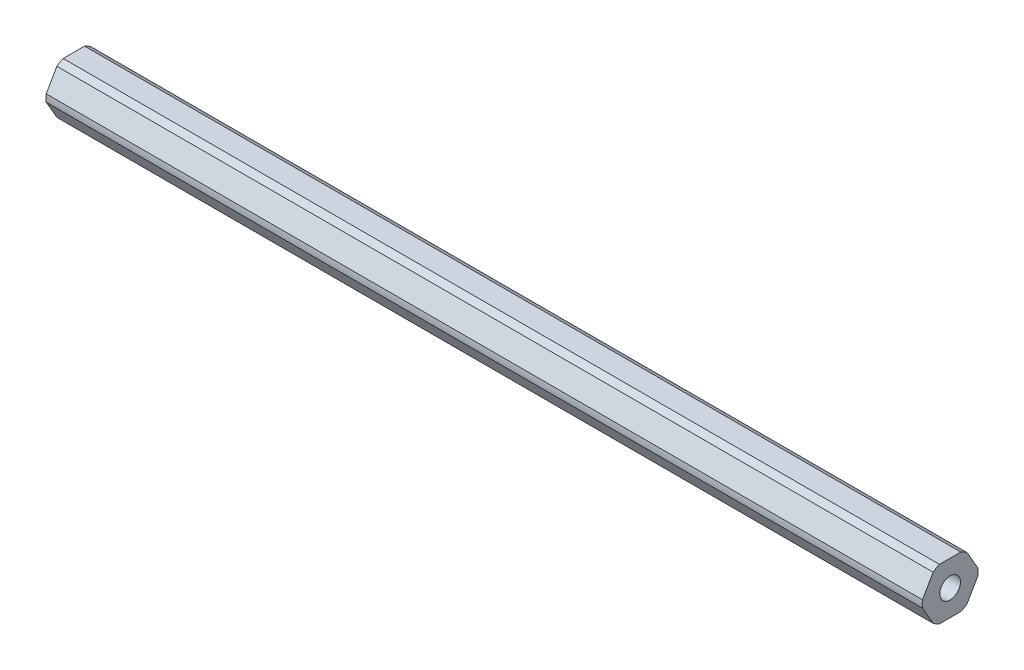
ISO-10303-21;
HEADER;
FILE_DESCRIPTION(('STEP AP214'),'2;1');
FILE_NAME('part.step','',(''),(''),'','','');
FILE_SCHEMA(('AUTOMOTIVE_DESIGN { 1 0 10303 214 1 1 1 1 }'));
ENDSEC;
DATA;
#1=APPLICATION_CONTEXT('core data for automotive mechanical design processes');
#2=APPLICATION_PROTOCOL_DEFINITION('international standard','automotive_design',2000,#1);
#3=PRODUCT_CONTEXT('',#1,'mechanical');
#4=PRODUCT('Part','Part','',(#3));
#5=PRODUCT_RELATED_PRODUCT_CATEGORY('part','',(#4));
#6=PRODUCT_DEFINITION_FORMATION('','',#4);
#7=PRODUCT_DEFINITION_CONTEXT('part definition',#1,'design');
#8=PRODUCT_DEFINITION('design','',#6,#7);
#9=PRODUCT_DEFINITION_SHAPE('','',#8);
#10=(LENGTH_UNIT() NAMED_UNIT(*) SI_UNIT(.MILLI.,.METRE.));
#11=(NAMED_UNIT(*) PLANE_ANGLE_UNIT() SI_UNIT($,.RADIAN.));
#12=(NAMED_UNIT(*) SI_UNIT($,.STERADIAN.) SOLID_ANGLE_UNIT());
#13=UNCERTAINTY_MEASURE_WITH_UNIT(LENGTH_MEASURE(1.E-05),#10,'distance_accuracy_value','');
#14=(GEOMETRIC_REPRESENTATION_CONTEXT(3) GLOBAL_UNCERTAINTY_ASSIGNED_CONTEXT((#13)) GLOBAL_UNIT_ASSIGNED_CONTEXT((#10,
#11,#12)) REPRESENTATION_CONTEXT('',''));
#15=CARTESIAN_POINT('',(0.,0.,0.));
#16=DIRECTION('',(0.,0.,1.));
#17=DIRECTION('',(1.,0.,0.));
#18=AXIS2_PLACEMENT_3D('',#15,#16,#17);
#19=CARTESIAN_POINT('',(304.8,-92.0747265172784,197.700265));
#20=DIRECTION('',(0.,-0.5,0.866025403784439));
#21=DIRECTION('',(0.,-0.866025403784439,-0.5));
#22=AXIS2_PLACEMENT_3D('',#19,#20,#21);
#23=PLANE('',#22);
#24=DIRECTION('',(-1.,0.,0.));
#25=VECTOR('',#24,1.);
#26=CARTESIAN_POINT('',(304.8,-94.3555451597345,196.383433742805));
#27=LINE('',#26,#25);
#28=CARTESIAN_POINT('',(304.8,-94.3555451597344,196.383433742805));
#29=VERTEX_POINT('',#28);
#30=CARTESIAN_POINT('',(88.9,-94.3555451597344,196.383433742805));
#31=VERTEX_POINT('',#30);
#32=EDGE_CURVE('E164',#29,#31,#27,.T.);
#33=ORIENTED_EDGE('',*,*,#32,.T.);
#34=DIRECTION('',(0.,-0.866025403784437,-0.5));
#35=VECTOR('',#34,1.);
#36=CARTESIAN_POINT('',(88.9,-92.0747265172784,197.700265));
#37=LINE('',#36,#35);
#38=CARTESIAN_POINT('',(88.9,-89.7939078748223,199.017096257194));
#39=VERTEX_POINT('',#38);
#40=EDGE_CURVE('E135',#39,#31,#37,.T.);
#41=ORIENTED_EDGE('',*,*,#40,.F.);
#42=DIRECTION('',(-1.,0.,0.));
#43=VECTOR('',#42,1.);
#44=CARTESIAN_POINT('',(304.8,-89.7939078748223,199.017096257194));
#45=LINE('',#44,#43);
#46=CARTESIAN_POINT('',(304.8,-89.7939078748223,199.017096257194));
#47=VERTEX_POINT('',#46);
#48=EDGE_CURVE('E166',#39,#47,#45,.F.);
#49=ORIENTED_EDGE('',*,*,#48,.T.);
#50=DIRECTION('',(0.,0.866025403784439,0.5));
#51=VECTOR('',#50,1.);
#52=CARTESIAN_POINT('',(304.8,-92.0747265172784,197.700265));
#53=LINE('',#52,#51);
#54=EDGE_CURVE('E172',#29,#47,#53,.T.);
#55=ORIENTED_EDGE('',*,*,#54,.F.);
#56=EDGE_LOOP('',(#33,#41,#49,#55));
#57=FACE_BOUND('',#56,.T.);
#58=ADVANCED_FACE('F17',(#57),#23,.F.);
#59=CARTESIAN_POINT('',(304.8,-88.8994530345568,203.2));
#60=DIRECTION('',(0.,-1.,0.));
#61=DIRECTION('',(0.,0.,-1.));
#62=AXIS2_PLACEMENT_3D('',#59,#60,#61);
#63=PLANE('',#62);
#64=DIRECTION('',(-1.,0.,0.));
#65=VECTOR('',#64,1.);
#66=CARTESIAN_POINT('',(304.8,-88.8994530345568,200.56633748561));
#67=LINE('',#66,#65);
#68=CARTESIAN_POINT('',(304.8,-88.8994530345568,200.56633748561));
#69=VERTEX_POINT('',#68);
#70=CARTESIAN_POINT('',(88.9,-88.8994530345568,200.56633748561));
#71=VERTEX_POINT('',#70);
#72=EDGE_CURVE('E116',#69,#71,#67,.T.);
#73=ORIENTED_EDGE('',*,*,#72,.T.);
#74=DIRECTION('',(0.,0.,-1.));
#75=VECTOR('',#74,1.);
#76=CARTESIAN_POINT('',(88.9,-88.8994530345568,203.2));
#77=LINE('',#76,#75);
#78=CARTESIAN_POINT('',(88.9,-88.8994530345568,205.833662514389));
#79=VERTEX_POINT('',#78);
#80=EDGE_CURVE('E132',#79,#71,#77,.T.);
#81=ORIENTED_EDGE('',*,*,#80,.F.);
#82=DIRECTION('',(-1.,0.,0.));
#83=VECTOR('',#82,1.);
#84=CARTESIAN_POINT('',(304.8,-88.8994530345568,205.833662514389));
#85=LINE('',#84,#83);
#86=CARTESIAN_POINT('',(304.8,-88.8994530345568,205.833662514389));
#87=VERTEX_POINT('',#86);
#88=EDGE_CURVE('E161',#79,#87,#85,.F.);
#89=ORIENTED_EDGE('',*,*,#88,.T.);
#90=DIRECTION('',(0.,0.,1.));
#91=VECTOR('',#90,1.);
#92=CARTESIAN_POINT('',(304.8,-88.8994530345568,203.2));
#93=LINE('',#92,#91);
#94=EDGE_CURVE('E175',#69,#87,#93,.T.);
#95=ORIENTED_EDGE('',*,*,#94,.F.);
#96=EDGE_LOOP('',(#73,#81,#89,#95));
#97=FACE_BOUND('',#96,.T.);
#98=ADVANCED_FACE('F225',(#97),#63,.F.);
#99=CARTESIAN_POINT('',(304.8,-92.0747265172784,208.699735));
#100=DIRECTION('',(0.,-0.5,-0.866025403784437));
#101=DIRECTION('',(0.,0.866025403784437,-0.5));
#102=AXIS2_PLACEMENT_3D('',#99,#100,#101);
#103=PLANE('',#102);
#104=DIRECTION('',(-1.,0.,0.));
#105=VECTOR('',#104,1.);
#106=CARTESIAN_POINT('',(304.8,-89.7939078748224,207.382903742805));
#107=LINE('',#106,#105);
#108=CARTESIAN_POINT('',(304.8,-89.7939078748224,207.382903742805));
#109=VERTEX_POINT('',#108);
#110=CARTESIAN_POINT('',(88.9,-89.7939078748224,207.382903742805));
#111=VERTEX_POINT('',#110);
#112=EDGE_CURVE('E117',#109,#111,#107,.T.);
#113=ORIENTED_EDGE('',*,*,#112,.T.);
#114=DIRECTION('',(0.,0.866025403784437,-0.5));
#115=VECTOR('',#114,1.);
#116=CARTESIAN_POINT('',(88.9,-92.0747265172784,208.699735));
#117=LINE('',#116,#115);
#118=CARTESIAN_POINT('',(88.9,-94.3555451597344,210.016566257195));
#119=VERTEX_POINT('',#118);
#120=EDGE_CURVE('E123',#119,#111,#117,.T.);
#121=ORIENTED_EDGE('',*,*,#120,.F.);
#122=DIRECTION('',(-1.,0.,0.));
#123=VECTOR('',#122,1.);
#124=CARTESIAN_POINT('',(304.8,-94.3555451597343,210.016566257195));
#125=LINE('',#124,#123);
#126=CARTESIAN_POINT('',(304.8,-94.3555451597344,210.016566257195));
#127=VERTEX_POINT('',#126);
#128=EDGE_CURVE('E105',#119,#127,#125,.F.);
#129=ORIENTED_EDGE('',*,*,#128,.T.);
#130=DIRECTION('',(0.,-0.866025403784437,0.5));
#131=VECTOR('',#130,1.);
#132=CARTESIAN_POINT('',(304.8,-92.0747265172784,208.699735));
#133=LINE('',#132,#131);
#134=EDGE_CURVE('E178',#109,#127,#133,.T.);
#135=ORIENTED_EDGE('',*,*,#134,.F.);
#136=EDGE_LOOP('',(#113,#121,#129,#135));
#137=FACE_BOUND('',#136,.T.);
#138=ADVANCED_FACE('F130',(#137),#103,.F.);
#139=CARTESIAN_POINT('',(304.8,-98.4252734827216,208.699735));
#140=DIRECTION('',(0.,0.5,-0.866025403784437));
#141=DIRECTION('',(0.,0.866025403784437,0.5));
#142=AXIS2_PLACEMENT_3D('',#139,#140,#141);
#143=PLANE('',#142);
#144=DIRECTION('',(-1.,0.,0.));
#145=VECTOR('',#144,1.);
#146=CARTESIAN_POINT('',(304.8,-96.1444548402656,210.016566257195));
#147=LINE('',#146,#145);
#148=CARTESIAN_POINT('',(304.8,-96.1444548402656,210.016566257195));
#149=VERTEX_POINT('',#148);
#150=CARTESIAN_POINT('',(88.9,-96.1444548402656,210.016566257195));
#151=VERTEX_POINT('',#150);
#152=EDGE_CURVE('E154',#149,#151,#147,.T.);
#153=ORIENTED_EDGE('',*,*,#152,.T.);
#154=DIRECTION('',(0.,0.866025403784437,0.5));
#155=VECTOR('',#154,1.);
#156=CARTESIAN_POINT('',(88.9,-98.4252734827216,208.699735));
#157=LINE('',#156,#155);
#158=CARTESIAN_POINT('',(88.9,-100.706092125178,207.382903742805));
#159=VERTEX_POINT('',#158);
#160=EDGE_CURVE('E126',#159,#151,#157,.T.);
#161=ORIENTED_EDGE('',*,*,#160,.F.);
#162=DIRECTION('',(-1.,0.,0.));
#163=VECTOR('',#162,1.);
#164=CARTESIAN_POINT('',(304.8,-100.706092125178,207.382903742805));
#165=LINE('',#164,#163);
#166=CARTESIAN_POINT('',(304.8,-100.706092125178,207.382903742805));
#167=VERTEX_POINT('',#166);
#168=EDGE_CURVE('E156',#159,#167,#165,.F.);
#169=ORIENTED_EDGE('',*,*,#168,.T.);
#170=DIRECTION('',(0.,-0.866025403784437,-0.5));
#171=VECTOR('',#170,1.);
#172=CARTESIAN_POINT('',(304.8,-98.4252734827216,208.699735));
#173=LINE('',#172,#171);
#174=EDGE_CURVE('E180',#149,#167,#173,.T.);
#175=ORIENTED_EDGE('',*,*,#174,.F.);
#176=EDGE_LOOP('',(#153,#161,#169,#175));
#177=FACE_BOUND('',#176,.T.);
#178=ADVANCED_FACE('F230',(#177),#143,.F.);
#179=CARTESIAN_POINT('',(304.8,-101.600546965443,203.2));
#180=DIRECTION('',(0.,1.,0.));
#181=DIRECTION('',(0.,0.,1.));
#182=AXIS2_PLACEMENT_3D('',#179,#180,#181);
#183=PLANE('',#182);
#184=DIRECTION('',(-1.,0.,0.));
#185=VECTOR('',#184,1.);
#186=CARTESIAN_POINT('',(304.8,-101.600546965443,205.833662514389));
#187=LINE('',#186,#185);
#188=CARTESIAN_POINT('',(304.8,-101.600546965443,205.833662514389));
#189=VERTEX_POINT('',#188);
#190=CARTESIAN_POINT('',(88.9,-101.600546965443,205.833662514389));
#191=VERTEX_POINT('',#190);
#192=EDGE_CURVE('E149',#189,#191,#187,.T.);
#193=ORIENTED_EDGE('',*,*,#192,.T.);
#194=DIRECTION('',(0.,0.,1.));
#195=VECTOR('',#194,1.);
#196=CARTESIAN_POINT('',(88.9,-101.600546965443,203.2));
#197=LINE('',#196,#195);
#198=CARTESIAN_POINT('',(88.9,-101.600546965443,200.56633748561));
#199=VERTEX_POINT('',#198);
#200=EDGE_CURVE('E137',#199,#191,#197,.T.);
#201=ORIENTED_EDGE('',*,*,#200,.F.);
#202=DIRECTION('',(-1.,0.,0.));
#203=VECTOR('',#202,1.);
#204=CARTESIAN_POINT('',(304.8,-101.600546965443,200.56633748561));
#205=LINE('',#204,#203);
#206=CARTESIAN_POINT('',(304.8,-101.600546965443,200.56633748561));
#207=VERTEX_POINT('',#206);
#208=EDGE_CURVE('E151',#199,#207,#205,.F.);
#209=ORIENTED_EDGE('',*,*,#208,.T.);
#210=DIRECTION('',(0.,0.,-1.));
#211=VECTOR('',#210,1.);
#212=CARTESIAN_POINT('',(304.8,-101.600546965443,203.2));
#213=LINE('',#212,#211);
#214=EDGE_CURVE('E24',#189,#207,#213,.T.);
#215=ORIENTED_EDGE('',*,*,#214,.F.);
#216=EDGE_LOOP('',(#193,#201,#209,#215));
#217=FACE_BOUND('',#216,.T.);
#218=ADVANCED_FACE('F190',(#217),#183,.F.);
#219=CARTESIAN_POINT('',(304.8,-98.4252734827216,197.700265));
#220=DIRECTION('',(0.,0.5,0.866025403784437));
#221=DIRECTION('',(0.,-0.866025403784437,0.5));
#222=AXIS2_PLACEMENT_3D('',#219,#220,#221);
#223=PLANE('',#222);
#224=DIRECTION('',(-1.,0.,0.));
#225=VECTOR('',#224,1.);
#226=CARTESIAN_POINT('',(304.8,-100.706092125178,199.017096257194));
#227=LINE('',#226,#225);
#228=CARTESIAN_POINT('',(304.8,-100.706092125178,199.017096257194));
#229=VERTEX_POINT('',#228);
#230=CARTESIAN_POINT('',(88.9,-100.706092125178,199.017096257194));
#231=VERTEX_POINT('',#230);
#232=EDGE_CURVE('E39',#229,#231,#227,.T.);
#233=ORIENTED_EDGE('',*,*,#232,.T.);
#234=DIRECTION('',(0.,-0.866025403784439,0.5));
#235=VECTOR('',#234,1.);
#236=CARTESIAN_POINT('',(88.9,-98.4252734827216,197.700265));
#237=LINE('',#236,#235);
#238=CARTESIAN_POINT('',(88.9,-96.1444548402655,196.383433742805));
#239=VERTEX_POINT('',#238);
#240=EDGE_CURVE('E200',#239,#231,#237,.T.);
#241=ORIENTED_EDGE('',*,*,#240,.F.);
#242=DIRECTION('',(-1.,0.,0.));
#243=VECTOR('',#242,1.);
#244=CARTESIAN_POINT('',(304.8,-96.1444548402655,196.383433742805));
#245=LINE('',#244,#243);
#246=CARTESIAN_POINT('',(304.8,-96.1444548402655,196.383433742805));
#247=VERTEX_POINT('',#246);
#248=EDGE_CURVE('E147',#239,#247,#245,.F.);
#249=ORIENTED_EDGE('',*,*,#248,.T.);
#250=DIRECTION('',(0.,0.866025403784437,-0.5));
#251=VECTOR('',#250,1.);
#252=CARTESIAN_POINT('',(304.8,-98.4252734827216,197.700265));
#253=LINE('',#252,#251);
#254=EDGE_CURVE('E11',#229,#247,#253,.T.);
#255=ORIENTED_EDGE('',*,*,#254,.F.);
#256=EDGE_LOOP('',(#233,#241,#249,#255));
#257=FACE_BOUND('',#256,.T.);
#258=ADVANCED_FACE('F219',(#257),#223,.F.);
#259=CARTESIAN_POINT('',(304.8,-95.25,203.2));
#260=DIRECTION('',(1.,0.,0.));
#261=DIRECTION('',(0.,0.,-1.));
#262=AXIS2_PLACEMENT_3D('',#259,#260,#261);
#263=PLANE('',#262);
#264=CARTESIAN_POINT('',(304.8,-95.25,203.2));
#265=DIRECTION('',(1.,0.,0.));
#266=DIRECTION('',(0.,0.,-1.));
#267=AXIS2_PLACEMENT_3D('',#264,#265,#266);
#268=CIRCLE('',#267,2.5527);
#269=CARTESIAN_POINT('',(304.8,-95.25,200.6473));
#270=VERTEX_POINT('',#269);
#271=EDGE_CURVE('E169',#270,#270,#268,.T.);
#272=ORIENTED_EDGE('',*,*,#271,.F.);
#273=EDGE_LOOP('',(#272));
#274=FACE_BOUND('',#273,.T.);
#275=ORIENTED_EDGE('',*,*,#54,.T.);
#276=CARTESIAN_POINT('',(304.8,-95.25,203.2));
#277=DIRECTION('',(1.,0.,0.));
#278=DIRECTION('',(0.,0.,-1.));
#279=AXIS2_PLACEMENT_3D('',#276,#277,#278);
#280=CIRCLE('',#279,6.875);
#281=EDGE_CURVE('E145',#47,#69,#280,.T.);
#282=ORIENTED_EDGE('',*,*,#281,.T.);
#283=ORIENTED_EDGE('',*,*,#94,.T.);
#284=EDGE_CURVE('E223',#87,#109,#280,.T.);
#285=ORIENTED_EDGE('',*,*,#284,.T.);
#286=ORIENTED_EDGE('',*,*,#134,.T.);
#287=EDGE_CURVE('E111',#127,#149,#280,.T.);
#288=ORIENTED_EDGE('',*,*,#287,.T.);
#289=ORIENTED_EDGE('',*,*,#174,.T.);
#290=EDGE_CURVE('E188',#167,#189,#280,.T.);
#291=ORIENTED_EDGE('',*,*,#290,.T.);
#292=ORIENTED_EDGE('',*,*,#214,.T.);
#293=EDGE_CURVE('E144',#207,#229,#280,.T.);
#294=ORIENTED_EDGE('',*,*,#293,.T.);
#295=ORIENTED_EDGE('',*,*,#254,.T.);
#296=EDGE_CURVE('E31',#247,#29,#280,.T.);
#297=ORIENTED_EDGE('',*,*,#296,.T.);
#298=EDGE_LOOP('',(#275,#282,#283,#285,#286,#288,#289,#291,#292,#294,#295,#297));
#299=FACE_BOUND('',#298,.T.);
#300=ADVANCED_FACE('F186',(#274,#299),#263,.T.);
#301=CARTESIAN_POINT('',(304.8,-95.25,203.2));
#302=DIRECTION('',(-1.,0.,0.));
#303=DIRECTION('',(0.,0.,1.));
#304=AXIS2_PLACEMENT_3D('',#301,#302,#303);
#305=CYLINDRICAL_SURFACE('',#304,2.5527);
#306=ORIENTED_EDGE('',*,*,#271,.T.);
#307=EDGE_LOOP('',(#306));
#308=FACE_BOUND('',#307,.T.);
#309=CARTESIAN_POINT('',(88.9,-95.25,203.2));
#310=DIRECTION('',(-1.,0.,0.));
#311=DIRECTION('',(0.,0.,1.));
#312=AXIS2_PLACEMENT_3D('',#309,#310,#311);
#313=CIRCLE('',#312,2.5527);
#314=CARTESIAN_POINT('',(88.9,-95.25,205.7527));
#315=VERTEX_POINT('',#314);
#316=EDGE_CURVE('E204',#315,#315,#313,.T.);
#317=ORIENTED_EDGE('',*,*,#316,.T.);
#318=EDGE_LOOP('',(#317));
#319=FACE_BOUND('',#318,.T.);
#320=ADVANCED_FACE('F244',(#308,#319),#305,.F.);
#321=CARTESIAN_POINT('',(304.8,-95.25,203.2));
#322=DIRECTION('',(-1.,0.,0.));
#323=DIRECTION('',(0.,0.,1.));
#324=AXIS2_PLACEMENT_3D('',#321,#322,#323);
#325=CYLINDRICAL_SURFACE('',#324,6.875);
#326=ORIENTED_EDGE('',*,*,#208,.F.);
#327=CARTESIAN_POINT('',(88.9,-95.25,203.2));
#328=DIRECTION('',(-1.,0.,0.));
#329=DIRECTION('',(0.,0.,1.));
#330=AXIS2_PLACEMENT_3D('',#327,#328,#329);
#331=CIRCLE('',#330,6.875);
#332=EDGE_CURVE('E196',#231,#199,#331,.T.);
#333=ORIENTED_EDGE('',*,*,#332,.F.);
#334=ORIENTED_EDGE('',*,*,#232,.F.);
#335=ORIENTED_EDGE('',*,*,#293,.F.);
#336=EDGE_LOOP('',(#326,#333,#334,#335));
#337=FACE_BOUND('',#336,.T.);
#338=ADVANCED_FACE('F195',(#337),#325,.T.);
#339=ORIENTED_EDGE('',*,*,#296,.F.);
#340=ORIENTED_EDGE('',*,*,#248,.F.);
#341=EDGE_CURVE('E201',#31,#239,#331,.T.);
#342=ORIENTED_EDGE('',*,*,#341,.F.);
#343=ORIENTED_EDGE('',*,*,#32,.F.);
#344=EDGE_LOOP('',(#339,#340,#342,#343));
#345=FACE_BOUND('',#344,.T.);
#346=ADVANCED_FACE('F217',(#345),#325,.T.);
#347=ORIENTED_EDGE('',*,*,#168,.F.);
#348=EDGE_CURVE('E127',#191,#159,#331,.T.);
#349=ORIENTED_EDGE('',*,*,#348,.F.);
#350=ORIENTED_EDGE('',*,*,#192,.F.);
#351=ORIENTED_EDGE('',*,*,#290,.F.);
#352=EDGE_LOOP('',(#347,#349,#350,#351));
#353=FACE_BOUND('',#352,.T.);
#354=ADVANCED_FACE('F232',(#353),#325,.T.);
#355=ORIENTED_EDGE('',*,*,#128,.F.);
#356=EDGE_CURVE('E108',#151,#119,#331,.T.);
#357=ORIENTED_EDGE('',*,*,#356,.F.);
#358=ORIENTED_EDGE('',*,*,#152,.F.);
#359=ORIENTED_EDGE('',*,*,#287,.F.);
#360=EDGE_LOOP('',(#355,#357,#358,#359));
#361=FACE_BOUND('',#360,.T.);
#362=ADVANCED_FACE('F107',(#361),#325,.T.);
#363=ORIENTED_EDGE('',*,*,#88,.F.);
#364=EDGE_CURVE('E129',#111,#79,#331,.T.);
#365=ORIENTED_EDGE('',*,*,#364,.F.);
#366=ORIENTED_EDGE('',*,*,#112,.F.);
#367=ORIENTED_EDGE('',*,*,#284,.F.);
#368=EDGE_LOOP('',(#363,#365,#366,#367));
#369=FACE_BOUND('',#368,.T.);
#370=ADVANCED_FACE('F227',(#369),#325,.T.);
#371=ORIENTED_EDGE('',*,*,#48,.F.);
#372=EDGE_CURVE('E202',#71,#39,#331,.T.);
#373=ORIENTED_EDGE('',*,*,#372,.F.);
#374=ORIENTED_EDGE('',*,*,#72,.F.);
#375=ORIENTED_EDGE('',*,*,#281,.F.);
#376=EDGE_LOOP('',(#371,#373,#374,#375));
#377=FACE_BOUND('',#376,.T.);
#378=ADVANCED_FACE('F240',(#377),#325,.T.);
#379=CARTESIAN_POINT('',(88.9,-95.25,203.2));
#380=DIRECTION('',(-1.,0.,0.));
#381=DIRECTION('',(0.,0.,-1.));
#382=AXIS2_PLACEMENT_3D('',#379,#380,#381);
#383=PLANE('',#382);
#384=ORIENTED_EDGE('',*,*,#316,.F.);
#385=EDGE_LOOP('',(#384));
#386=FACE_BOUND('',#385,.T.);
#387=ORIENTED_EDGE('',*,*,#120,.T.);
#388=ORIENTED_EDGE('',*,*,#364,.T.);
#389=ORIENTED_EDGE('',*,*,#80,.T.);
#390=ORIENTED_EDGE('',*,*,#372,.T.);
#391=ORIENTED_EDGE('',*,*,#40,.T.);
#392=ORIENTED_EDGE('',*,*,#341,.T.);
#393=ORIENTED_EDGE('',*,*,#240,.T.);
#394=ORIENTED_EDGE('',*,*,#332,.T.);
#395=ORIENTED_EDGE('',*,*,#200,.T.);
#396=ORIENTED_EDGE('',*,*,#348,.T.);
#397=ORIENTED_EDGE('',*,*,#160,.T.);
#398=ORIENTED_EDGE('',*,*,#356,.T.);
#399=EDGE_LOOP('',(#387,#388,#389,#390,#391,#392,#393,#394,#395,#396,#397,#398));
#400=FACE_BOUND('',#399,.T.);
#401=ADVANCED_FACE('F121',(#386,#400),#383,.T.);
#402=CLOSED_SHELL('',(#58,#98,#138,#178,#218,#258,#300,#320,#338,#346,#354,#362,#370,#378,#401));
#403=MANIFOLD_SOLID_BREP('B1',#402);
#404=ADVANCED_BREP_SHAPE_REPRESENTATION('',(#18,#403),#14);
#405=SHAPE_DEFINITION_REPRESENTATION(#9,#404);
ENDSEC;
END-ISO-10303-21;
